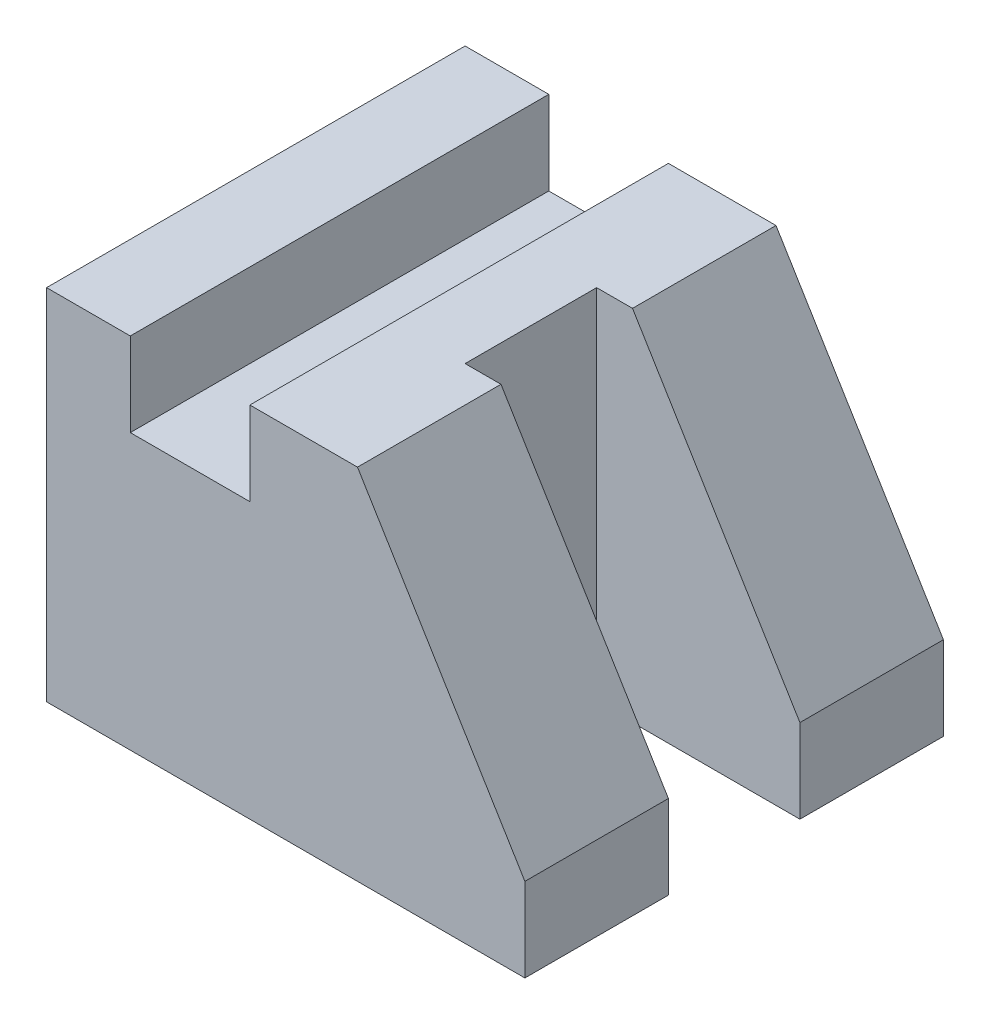
ISO-10303-21;
HEADER;
FILE_DESCRIPTION(('STEP AP214'),'2;1');
FILE_NAME('part.step','',(''),(''),'','','');
FILE_SCHEMA(('AUTOMOTIVE_DESIGN { 1 0 10303 214 1 1 1 1 }'));
ENDSEC;
DATA;
#1=APPLICATION_CONTEXT('core data for automotive mechanical design processes');
#2=APPLICATION_PROTOCOL_DEFINITION('international standard','automotive_design',2000,#1);
#3=PRODUCT_CONTEXT('',#1,'mechanical');
#4=PRODUCT('Part','Part','',(#3));
#5=PRODUCT_RELATED_PRODUCT_CATEGORY('part','',(#4));
#6=PRODUCT_DEFINITION_FORMATION('','',#4);
#7=PRODUCT_DEFINITION_CONTEXT('part definition',#1,'design');
#8=PRODUCT_DEFINITION('design','',#6,#7);
#9=PRODUCT_DEFINITION_SHAPE('','',#8);
#10=(LENGTH_UNIT() NAMED_UNIT(*) SI_UNIT(.MILLI.,.METRE.));
#11=(NAMED_UNIT(*) PLANE_ANGLE_UNIT() SI_UNIT($,.RADIAN.));
#12=(NAMED_UNIT(*) SI_UNIT($,.STERADIAN.) SOLID_ANGLE_UNIT());
#13=UNCERTAINTY_MEASURE_WITH_UNIT(LENGTH_MEASURE(1.E-05),#10,'distance_accuracy_value','');
#14=(GEOMETRIC_REPRESENTATION_CONTEXT(3) GLOBAL_UNCERTAINTY_ASSIGNED_CONTEXT((#13)) GLOBAL_UNIT_ASSIGNED_CONTEXT((#10,
#11,#12)) REPRESENTATION_CONTEXT('',''));
#15=CARTESIAN_POINT('',(0.,0.,0.));
#16=DIRECTION('',(0.,0.,1.));
#17=DIRECTION('',(1.,0.,0.));
#18=AXIS2_PLACEMENT_3D('',#15,#16,#17);
#19=CARTESIAN_POINT('',(52.,60.,-70.));
#20=DIRECTION('',(0.854198555614438,0.519946946895745,0.));
#21=DIRECTION('',(-0.519946946895745,0.854198555614439,0.));
#22=AXIS2_PLACEMENT_3D('',#19,#20,#21);
#23=PLANE('',#22);
#24=DIRECTION('',(-0.519946946895745,0.854198555614439,0.));
#25=VECTOR('',#24,1.);
#26=CARTESIAN_POINT('',(52.,60.,-46.));
#27=LINE('',#26,#25);
#28=CARTESIAN_POINT('',(80.,14.,-46.));
#29=VERTEX_POINT('',#28);
#30=CARTESIAN_POINT('',(52.,60.,-46.));
#31=VERTEX_POINT('',#30);
#32=EDGE_CURVE('E175',#29,#31,#27,.T.);
#33=ORIENTED_EDGE('',*,*,#32,.F.);
#34=DIRECTION('',(0.,0.,1.));
#35=VECTOR('',#34,1.);
#36=CARTESIAN_POINT('',(80.,14.,-70.));
#37=LINE('',#36,#35);
#38=CARTESIAN_POINT('',(80.,14.,-70.));
#39=VERTEX_POINT('',#38);
#40=EDGE_CURVE('E219',#39,#29,#37,.T.);
#41=ORIENTED_EDGE('',*,*,#40,.F.);
#42=DIRECTION('',(-0.519946946895745,0.854198555614439,0.));
#43=VECTOR('',#42,1.);
#44=CARTESIAN_POINT('',(52.,60.,-70.));
#45=LINE('',#44,#43);
#46=CARTESIAN_POINT('',(52.,60.,-70.));
#47=VERTEX_POINT('',#46);
#48=EDGE_CURVE('E297',#39,#47,#45,.T.);
#49=ORIENTED_EDGE('',*,*,#48,.T.);
#50=DIRECTION('',(0.,0.,1.));
#51=VECTOR('',#50,1.);
#52=CARTESIAN_POINT('',(52.,60.,-70.));
#53=LINE('',#52,#51);
#54=EDGE_CURVE('E215',#47,#31,#53,.T.);
#55=ORIENTED_EDGE('',*,*,#54,.T.);
#56=EDGE_LOOP('',(#33,#41,#49,#55));
#57=FACE_BOUND('',#56,.T.);
#58=ADVANCED_FACE('F46',(#57),#23,.T.);
#59=CARTESIAN_POINT('',(80.,0.,-70.));
#60=DIRECTION('',(1.,0.,0.));
#61=DIRECTION('',(0.,0.,-1.));
#62=AXIS2_PLACEMENT_3D('',#59,#60,#61);
#63=PLANE('',#62);
#64=DIRECTION('',(0.,-1.,0.));
#65=VECTOR('',#64,1.);
#66=CARTESIAN_POINT('',(80.,170.847470805326,-46.));
#67=LINE('',#66,#65);
#68=CARTESIAN_POINT('',(80.,0.,-46.));
#69=VERTEX_POINT('',#68);
#70=EDGE_CURVE('E323',#29,#69,#67,.T.);
#71=ORIENTED_EDGE('',*,*,#70,.T.);
#72=DIRECTION('',(0.,0.,1.));
#73=VECTOR('',#72,1.);
#74=CARTESIAN_POINT('',(80.,0.,-70.));
#75=LINE('',#74,#73);
#76=CARTESIAN_POINT('',(80.,0.,-70.));
#77=VERTEX_POINT('',#76);
#78=EDGE_CURVE('E50',#77,#69,#75,.T.);
#79=ORIENTED_EDGE('',*,*,#78,.F.);
#80=DIRECTION('',(0.,1.,0.));
#81=VECTOR('',#80,1.);
#82=CARTESIAN_POINT('',(80.,0.,-70.));
#83=LINE('',#82,#81);
#84=EDGE_CURVE('E300',#77,#39,#83,.T.);
#85=ORIENTED_EDGE('',*,*,#84,.T.);
#86=ORIENTED_EDGE('',*,*,#40,.T.);
#87=EDGE_LOOP('',(#71,#79,#85,#86));
#88=FACE_BOUND('',#87,.T.);
#89=ADVANCED_FACE('F250',(#88),#63,.T.);
#90=CARTESIAN_POINT('',(0.,0.,-70.));
#91=DIRECTION('',(0.,-1.,0.));
#92=DIRECTION('',(0.,0.,-1.));
#93=AXIS2_PLACEMENT_3D('',#90,#91,#92);
#94=PLANE('',#93);
#95=DIRECTION('',(1.,0.,0.));
#96=VECTOR('',#95,1.);
#97=CARTESIAN_POINT('',(46.,0.,-46.));
#98=LINE('',#97,#96);
#99=CARTESIAN_POINT('',(46.,0.,-46.));
#100=VERTEX_POINT('',#99);
#101=EDGE_CURVE('E326',#100,#69,#98,.T.);
#102=ORIENTED_EDGE('',*,*,#101,.F.);
#103=DIRECTION('',(0.,0.,-1.));
#104=VECTOR('',#103,1.);
#105=CARTESIAN_POINT('',(46.,0.,-24.));
#106=LINE('',#105,#104);
#107=CARTESIAN_POINT('',(46.,0.,-24.));
#108=VERTEX_POINT('',#107);
#109=EDGE_CURVE('E330',#108,#100,#106,.T.);
#110=ORIENTED_EDGE('',*,*,#109,.F.);
#111=DIRECTION('',(-1.,0.,0.));
#112=VECTOR('',#111,1.);
#113=CARTESIAN_POINT('',(80.,0.,-24.));
#114=LINE('',#113,#112);
#115=CARTESIAN_POINT('',(80.,0.,-24.));
#116=VERTEX_POINT('',#115);
#117=EDGE_CURVE('E238',#116,#108,#114,.T.);
#118=ORIENTED_EDGE('',*,*,#117,.F.);
#119=CARTESIAN_POINT('',(80.,0.,0.));
#120=VERTEX_POINT('',#119);
#121=EDGE_CURVE('E169',#116,#120,#75,.T.);
#122=ORIENTED_EDGE('',*,*,#121,.T.);
#123=DIRECTION('',(1.,0.,0.));
#124=VECTOR('',#123,1.);
#125=CARTESIAN_POINT('',(0.,0.,0.));
#126=LINE('',#125,#124);
#127=CARTESIAN_POINT('',(0.,0.,0.));
#128=VERTEX_POINT('',#127);
#129=EDGE_CURVE('E170',#128,#120,#126,.T.);
#130=ORIENTED_EDGE('',*,*,#129,.F.);
#131=DIRECTION('',(0.,0.,1.));
#132=VECTOR('',#131,1.);
#133=CARTESIAN_POINT('',(0.,0.,-70.));
#134=LINE('',#133,#132);
#135=CARTESIAN_POINT('',(0.,0.,-70.));
#136=VERTEX_POINT('',#135);
#137=EDGE_CURVE('E12',#136,#128,#134,.T.);
#138=ORIENTED_EDGE('',*,*,#137,.F.);
#139=DIRECTION('',(1.,0.,0.));
#140=VECTOR('',#139,1.);
#141=CARTESIAN_POINT('',(0.,0.,-70.));
#142=LINE('',#141,#140);
#143=EDGE_CURVE('E203',#136,#77,#142,.T.);
#144=ORIENTED_EDGE('',*,*,#143,.T.);
#145=ORIENTED_EDGE('',*,*,#78,.T.);
#146=EDGE_LOOP('',(#102,#110,#118,#122,#130,#138,#144,#145));
#147=FACE_BOUND('',#146,.T.);
#148=ADVANCED_FACE('F48',(#147),#94,.T.);
#149=CARTESIAN_POINT('',(0.,0.,-70.));
#150=DIRECTION('',(-1.,0.,0.));
#151=DIRECTION('',(0.,0.,1.));
#152=AXIS2_PLACEMENT_3D('',#149,#150,#151);
#153=PLANE('',#152);
#154=DIRECTION('',(0.,-1.,0.));
#155=VECTOR('',#154,1.);
#156=CARTESIAN_POINT('',(0.,0.,0.));
#157=LINE('',#156,#155);
#158=CARTESIAN_POINT('',(0.,60.,0.));
#159=VERTEX_POINT('',#158);
#160=EDGE_CURVE('E200',#159,#128,#157,.T.);
#161=ORIENTED_EDGE('',*,*,#160,.F.);
#162=DIRECTION('',(0.,0.,1.));
#163=VECTOR('',#162,1.);
#164=CARTESIAN_POINT('',(0.,60.,-70.));
#165=LINE('',#164,#163);
#166=CARTESIAN_POINT('',(0.,60.,-70.));
#167=VERTEX_POINT('',#166);
#168=EDGE_CURVE('E56',#167,#159,#165,.T.);
#169=ORIENTED_EDGE('',*,*,#168,.F.);
#170=DIRECTION('',(0.,-1.,0.));
#171=VECTOR('',#170,1.);
#172=CARTESIAN_POINT('',(0.,0.,-70.));
#173=LINE('',#172,#171);
#174=EDGE_CURVE('E155',#167,#136,#173,.T.);
#175=ORIENTED_EDGE('',*,*,#174,.T.);
#176=ORIENTED_EDGE('',*,*,#137,.T.);
#177=EDGE_LOOP('',(#161,#169,#175,#176));
#178=FACE_BOUND('',#177,.T.);
#179=ADVANCED_FACE('F242',(#178),#153,.T.);
#180=CARTESIAN_POINT('',(0.,60.,-70.));
#181=DIRECTION('',(0.,1.,0.));
#182=DIRECTION('',(0.,0.,1.));
#183=AXIS2_PLACEMENT_3D('',#180,#181,#182);
#184=PLANE('',#183);
#185=DIRECTION('',(-1.,0.,0.));
#186=VECTOR('',#185,1.);
#187=CARTESIAN_POINT('',(0.,60.,0.));
#188=LINE('',#187,#186);
#189=CARTESIAN_POINT('',(14.,60.,0.));
#190=VERTEX_POINT('',#189);
#191=EDGE_CURVE('E141',#190,#159,#188,.T.);
#192=ORIENTED_EDGE('',*,*,#191,.F.);
#193=DIRECTION('',(0.,0.,1.));
#194=VECTOR('',#193,1.);
#195=CARTESIAN_POINT('',(14.,60.,-70.));
#196=LINE('',#195,#194);
#197=CARTESIAN_POINT('',(14.,60.,-70.));
#198=VERTEX_POINT('',#197);
#199=EDGE_CURVE('E135',#198,#190,#196,.T.);
#200=ORIENTED_EDGE('',*,*,#199,.F.);
#201=DIRECTION('',(-1.,0.,0.));
#202=VECTOR('',#201,1.);
#203=CARTESIAN_POINT('',(0.,60.,-70.));
#204=LINE('',#203,#202);
#205=EDGE_CURVE('E138',#198,#167,#204,.T.);
#206=ORIENTED_EDGE('',*,*,#205,.T.);
#207=ORIENTED_EDGE('',*,*,#168,.T.);
#208=EDGE_LOOP('',(#192,#200,#206,#207));
#209=FACE_BOUND('',#208,.T.);
#210=ADVANCED_FACE('F137',(#209),#184,.T.);
#211=CARTESIAN_POINT('',(14.,60.,-70.));
#212=DIRECTION('',(1.,0.,0.));
#213=DIRECTION('',(0.,0.,-1.));
#214=AXIS2_PLACEMENT_3D('',#211,#212,#213);
#215=PLANE('',#214);
#216=DIRECTION('',(0.,1.,0.));
#217=VECTOR('',#216,1.);
#218=CARTESIAN_POINT('',(14.,60.,0.));
#219=LINE('',#218,#217);
#220=CARTESIAN_POINT('',(14.,46.,0.));
#221=VERTEX_POINT('',#220);
#222=EDGE_CURVE('E195',#221,#190,#219,.T.);
#223=ORIENTED_EDGE('',*,*,#222,.F.);
#224=DIRECTION('',(0.,0.,1.));
#225=VECTOR('',#224,1.);
#226=CARTESIAN_POINT('',(14.,46.,-70.));
#227=LINE('',#226,#225);
#228=CARTESIAN_POINT('',(14.,46.,-70.));
#229=VERTEX_POINT('',#228);
#230=EDGE_CURVE('E147',#229,#221,#227,.T.);
#231=ORIENTED_EDGE('',*,*,#230,.F.);
#232=DIRECTION('',(0.,1.,0.));
#233=VECTOR('',#232,1.);
#234=CARTESIAN_POINT('',(14.,60.,-70.));
#235=LINE('',#234,#233);
#236=EDGE_CURVE('E153',#229,#198,#235,.T.);
#237=ORIENTED_EDGE('',*,*,#236,.T.);
#238=ORIENTED_EDGE('',*,*,#199,.T.);
#239=EDGE_LOOP('',(#223,#231,#237,#238));
#240=FACE_BOUND('',#239,.T.);
#241=ADVANCED_FACE('F158',(#240),#215,.T.);
#242=CARTESIAN_POINT('',(14.,46.,-70.));
#243=DIRECTION('',(0.,1.,0.));
#244=DIRECTION('',(0.,0.,1.));
#245=AXIS2_PLACEMENT_3D('',#242,#243,#244);
#246=PLANE('',#245);
#247=DIRECTION('',(-1.,0.,0.));
#248=VECTOR('',#247,1.);
#249=CARTESIAN_POINT('',(14.,46.,0.));
#250=LINE('',#249,#248);
#251=CARTESIAN_POINT('',(34.,46.,0.));
#252=VERTEX_POINT('',#251);
#253=EDGE_CURVE('E191',#252,#221,#250,.T.);
#254=ORIENTED_EDGE('',*,*,#253,.F.);
#255=DIRECTION('',(0.,0.,1.));
#256=VECTOR('',#255,1.);
#257=CARTESIAN_POINT('',(34.,46.,-70.));
#258=LINE('',#257,#256);
#259=CARTESIAN_POINT('',(34.,46.,-70.));
#260=VERTEX_POINT('',#259);
#261=EDGE_CURVE('E209',#260,#252,#258,.T.);
#262=ORIENTED_EDGE('',*,*,#261,.F.);
#263=DIRECTION('',(-1.,0.,0.));
#264=VECTOR('',#263,1.);
#265=CARTESIAN_POINT('',(14.,46.,-70.));
#266=LINE('',#265,#264);
#267=EDGE_CURVE('E160',#260,#229,#266,.T.);
#268=ORIENTED_EDGE('',*,*,#267,.T.);
#269=ORIENTED_EDGE('',*,*,#230,.T.);
#270=EDGE_LOOP('',(#254,#262,#268,#269));
#271=FACE_BOUND('',#270,.T.);
#272=ADVANCED_FACE('F290',(#271),#246,.T.);
#273=CARTESIAN_POINT('',(34.,46.,-70.));
#274=DIRECTION('',(-1.,0.,0.));
#275=DIRECTION('',(0.,0.,1.));
#276=AXIS2_PLACEMENT_3D('',#273,#274,#275);
#277=PLANE('',#276);
#278=DIRECTION('',(0.,-1.,0.));
#279=VECTOR('',#278,1.);
#280=CARTESIAN_POINT('',(34.,46.,0.));
#281=LINE('',#280,#279);
#282=CARTESIAN_POINT('',(34.,60.,0.));
#283=VERTEX_POINT('',#282);
#284=EDGE_CURVE('E187',#283,#252,#281,.T.);
#285=ORIENTED_EDGE('',*,*,#284,.F.);
#286=DIRECTION('',(0.,0.,1.));
#287=VECTOR('',#286,1.);
#288=CARTESIAN_POINT('',(34.,60.,-70.));
#289=LINE('',#288,#287);
#290=CARTESIAN_POINT('',(34.,60.,-70.));
#291=VERTEX_POINT('',#290);
#292=EDGE_CURVE('E212',#291,#283,#289,.T.);
#293=ORIENTED_EDGE('',*,*,#292,.F.);
#294=DIRECTION('',(0.,-1.,0.));
#295=VECTOR('',#294,1.);
#296=CARTESIAN_POINT('',(34.,46.,-70.));
#297=LINE('',#296,#295);
#298=EDGE_CURVE('E163',#291,#260,#297,.T.);
#299=ORIENTED_EDGE('',*,*,#298,.T.);
#300=ORIENTED_EDGE('',*,*,#261,.T.);
#301=EDGE_LOOP('',(#285,#293,#299,#300));
#302=FACE_BOUND('',#301,.T.);
#303=ADVANCED_FACE('F269',(#302),#277,.T.);
#304=CARTESIAN_POINT('',(34.,60.,-70.));
#305=DIRECTION('',(0.,1.,0.));
#306=DIRECTION('',(0.,0.,1.));
#307=AXIS2_PLACEMENT_3D('',#304,#305,#306);
#308=PLANE('',#307);
#309=DIRECTION('',(1.,0.,0.));
#310=VECTOR('',#309,1.);
#311=CARTESIAN_POINT('',(46.,60.,-46.));
#312=LINE('',#311,#310);
#313=CARTESIAN_POINT('',(46.,60.,-46.));
#314=VERTEX_POINT('',#313);
#315=EDGE_CURVE('E276',#314,#31,#312,.T.);
#316=ORIENTED_EDGE('',*,*,#315,.T.);
#317=ORIENTED_EDGE('',*,*,#54,.F.);
#318=DIRECTION('',(-1.,0.,0.));
#319=VECTOR('',#318,1.);
#320=CARTESIAN_POINT('',(34.,60.,-70.));
#321=LINE('',#320,#319);
#322=EDGE_CURVE('E293',#47,#291,#321,.T.);
#323=ORIENTED_EDGE('',*,*,#322,.T.);
#324=ORIENTED_EDGE('',*,*,#292,.T.);
#325=DIRECTION('',(-1.,0.,0.));
#326=VECTOR('',#325,1.);
#327=CARTESIAN_POINT('',(34.,60.,0.));
#328=LINE('',#327,#326);
#329=CARTESIAN_POINT('',(52.,60.,0.));
#330=VERTEX_POINT('',#329);
#331=EDGE_CURVE('E183',#330,#283,#328,.T.);
#332=ORIENTED_EDGE('',*,*,#331,.F.);
#333=CARTESIAN_POINT('',(52.,60.,-24.));
#334=VERTEX_POINT('',#333);
#335=EDGE_CURVE('E218',#334,#330,#53,.T.);
#336=ORIENTED_EDGE('',*,*,#335,.F.);
#337=DIRECTION('',(-1.,0.,0.));
#338=VECTOR('',#337,1.);
#339=CARTESIAN_POINT('',(80.,60.,-24.));
#340=LINE('',#339,#338);
#341=CARTESIAN_POINT('',(46.,60.,-24.));
#342=VERTEX_POINT('',#341);
#343=EDGE_CURVE('E282',#334,#342,#340,.T.);
#344=ORIENTED_EDGE('',*,*,#343,.T.);
#345=DIRECTION('',(0.,0.,-1.));
#346=VECTOR('',#345,1.);
#347=CARTESIAN_POINT('',(46.,60.,-24.));
#348=LINE('',#347,#346);
#349=EDGE_CURVE('E338',#342,#314,#348,.T.);
#350=ORIENTED_EDGE('',*,*,#349,.T.);
#351=EDGE_LOOP('',(#316,#317,#323,#324,#332,#336,#344,#350));
#352=FACE_BOUND('',#351,.T.);
#353=ADVANCED_FACE('F263',(#352),#308,.T.);
#354=DIRECTION('',(0.519946946895745,-0.854198555614439,0.));
#355=VECTOR('',#354,1.);
#356=CARTESIAN_POINT('',(52.,60.,-24.));
#357=LINE('',#356,#355);
#358=CARTESIAN_POINT('',(80.,14.,-24.));
#359=VERTEX_POINT('',#358);
#360=EDGE_CURVE('E64',#334,#359,#357,.T.);
#361=ORIENTED_EDGE('',*,*,#360,.F.);
#362=ORIENTED_EDGE('',*,*,#335,.T.);
#363=DIRECTION('',(-0.519946946895745,0.854198555614439,0.));
#364=VECTOR('',#363,1.);
#365=CARTESIAN_POINT('',(52.,60.,0.));
#366=LINE('',#365,#364);
#367=CARTESIAN_POINT('',(80.,14.,0.));
#368=VERTEX_POINT('',#367);
#369=EDGE_CURVE('E179',#368,#330,#366,.T.);
#370=ORIENTED_EDGE('',*,*,#369,.F.);
#371=EDGE_CURVE('E222',#359,#368,#37,.T.);
#372=ORIENTED_EDGE('',*,*,#371,.F.);
#373=EDGE_LOOP('',(#361,#362,#370,#372));
#374=FACE_BOUND('',#373,.T.);
#375=ADVANCED_FACE('F255',(#374),#23,.T.);
#376=DIRECTION('',(0.,-1.,0.));
#377=VECTOR('',#376,1.);
#378=CARTESIAN_POINT('',(80.,170.847470805326,-24.));
#379=LINE('',#378,#377);
#380=EDGE_CURVE('E312',#359,#116,#379,.T.);
#381=ORIENTED_EDGE('',*,*,#380,.F.);
#382=ORIENTED_EDGE('',*,*,#371,.T.);
#383=DIRECTION('',(0.,1.,0.));
#384=VECTOR('',#383,1.);
#385=CARTESIAN_POINT('',(80.,0.,0.));
#386=LINE('',#385,#384);
#387=EDGE_CURVE('E174',#120,#368,#386,.T.);
#388=ORIENTED_EDGE('',*,*,#387,.F.);
#389=ORIENTED_EDGE('',*,*,#121,.F.);
#390=EDGE_LOOP('',(#381,#382,#388,#389));
#391=FACE_BOUND('',#390,.T.);
#392=ADVANCED_FACE('F239',(#391),#63,.T.);
#393=CARTESIAN_POINT('',(0.,0.,-70.));
#394=DIRECTION('',(0.,0.,1.));
#395=DIRECTION('',(1.,0.,0.));
#396=AXIS2_PLACEMENT_3D('',#393,#394,#395);
#397=PLANE('',#396);
#398=ORIENTED_EDGE('',*,*,#143,.F.);
#399=ORIENTED_EDGE('',*,*,#174,.F.);
#400=ORIENTED_EDGE('',*,*,#205,.F.);
#401=ORIENTED_EDGE('',*,*,#236,.F.);
#402=ORIENTED_EDGE('',*,*,#267,.F.);
#403=ORIENTED_EDGE('',*,*,#298,.F.);
#404=ORIENTED_EDGE('',*,*,#322,.F.);
#405=ORIENTED_EDGE('',*,*,#48,.F.);
#406=ORIENTED_EDGE('',*,*,#84,.F.);
#407=EDGE_LOOP('',(#398,#399,#400,#401,#402,#403,#404,#405,#406));
#408=FACE_BOUND('',#407,.T.);
#409=ADVANCED_FACE('F151',(#408),#397,.F.);
#410=CARTESIAN_POINT('',(0.,0.,0.));
#411=DIRECTION('',(0.,0.,1.));
#412=DIRECTION('',(1.,0.,0.));
#413=AXIS2_PLACEMENT_3D('',#410,#411,#412);
#414=PLANE('',#413);
#415=ORIENTED_EDGE('',*,*,#129,.T.);
#416=ORIENTED_EDGE('',*,*,#387,.T.);
#417=ORIENTED_EDGE('',*,*,#369,.T.);
#418=ORIENTED_EDGE('',*,*,#331,.T.);
#419=ORIENTED_EDGE('',*,*,#284,.T.);
#420=ORIENTED_EDGE('',*,*,#253,.T.);
#421=ORIENTED_EDGE('',*,*,#222,.T.);
#422=ORIENTED_EDGE('',*,*,#191,.T.);
#423=ORIENTED_EDGE('',*,*,#160,.T.);
#424=EDGE_LOOP('',(#415,#416,#417,#418,#419,#420,#421,#422,#423));
#425=FACE_BOUND('',#424,.T.);
#426=ADVANCED_FACE('F241',(#425),#414,.T.);
#427=CARTESIAN_POINT('',(46.,170.847470805326,-46.));
#428=DIRECTION('',(0.,0.,-1.));
#429=DIRECTION('',(-1.,0.,0.));
#430=AXIS2_PLACEMENT_3D('',#427,#428,#429);
#431=PLANE('',#430);
#432=ORIENTED_EDGE('',*,*,#32,.T.);
#433=ORIENTED_EDGE('',*,*,#315,.F.);
#434=DIRECTION('',(0.,-1.,0.));
#435=VECTOR('',#434,1.);
#436=CARTESIAN_POINT('',(46.,170.847470805326,-46.));
#437=LINE('',#436,#435);
#438=EDGE_CURVE('E319',#314,#100,#437,.T.);
#439=ORIENTED_EDGE('',*,*,#438,.T.);
#440=ORIENTED_EDGE('',*,*,#101,.T.);
#441=ORIENTED_EDGE('',*,*,#70,.F.);
#442=EDGE_LOOP('',(#432,#433,#439,#440,#441));
#443=FACE_BOUND('',#442,.T.);
#444=ADVANCED_FACE('F359',(#443),#431,.F.);
#445=CARTESIAN_POINT('',(46.,170.847470805326,-24.));
#446=DIRECTION('',(-1.,0.,0.));
#447=DIRECTION('',(0.,0.,1.));
#448=AXIS2_PLACEMENT_3D('',#445,#446,#447);
#449=PLANE('',#448);
#450=DIRECTION('',(0.,-1.,0.));
#451=VECTOR('',#450,1.);
#452=CARTESIAN_POINT('',(46.,170.847470805326,-24.));
#453=LINE('',#452,#451);
#454=EDGE_CURVE('E315',#342,#108,#453,.T.);
#455=ORIENTED_EDGE('',*,*,#454,.T.);
#456=ORIENTED_EDGE('',*,*,#109,.T.);
#457=ORIENTED_EDGE('',*,*,#438,.F.);
#458=ORIENTED_EDGE('',*,*,#349,.F.);
#459=EDGE_LOOP('',(#455,#456,#457,#458));
#460=FACE_BOUND('',#459,.T.);
#461=ADVANCED_FACE('F347',(#460),#449,.F.);
#462=CARTESIAN_POINT('',(80.,170.847470805326,-24.));
#463=DIRECTION('',(0.,0.,1.));
#464=DIRECTION('',(1.,0.,0.));
#465=AXIS2_PLACEMENT_3D('',#462,#463,#464);
#466=PLANE('',#465);
#467=ORIENTED_EDGE('',*,*,#360,.T.);
#468=ORIENTED_EDGE('',*,*,#380,.T.);
#469=ORIENTED_EDGE('',*,*,#117,.T.);
#470=ORIENTED_EDGE('',*,*,#454,.F.);
#471=ORIENTED_EDGE('',*,*,#343,.F.);
#472=EDGE_LOOP('',(#467,#468,#469,#470,#471));
#473=FACE_BOUND('',#472,.T.);
#474=ADVANCED_FACE('F350',(#473),#466,.F.);
#475=CLOSED_SHELL('',(#58,#89,#148,#179,#210,#241,#272,#303,#353,#375,#392,#409,#426,#444,#461,#474));
#476=MANIFOLD_SOLID_BREP('B2',#475);
#477=ADVANCED_BREP_SHAPE_REPRESENTATION('',(#18,#476),#14);
#478=SHAPE_DEFINITION_REPRESENTATION(#9,#477);
ENDSEC;
END-ISO-10303-21;
